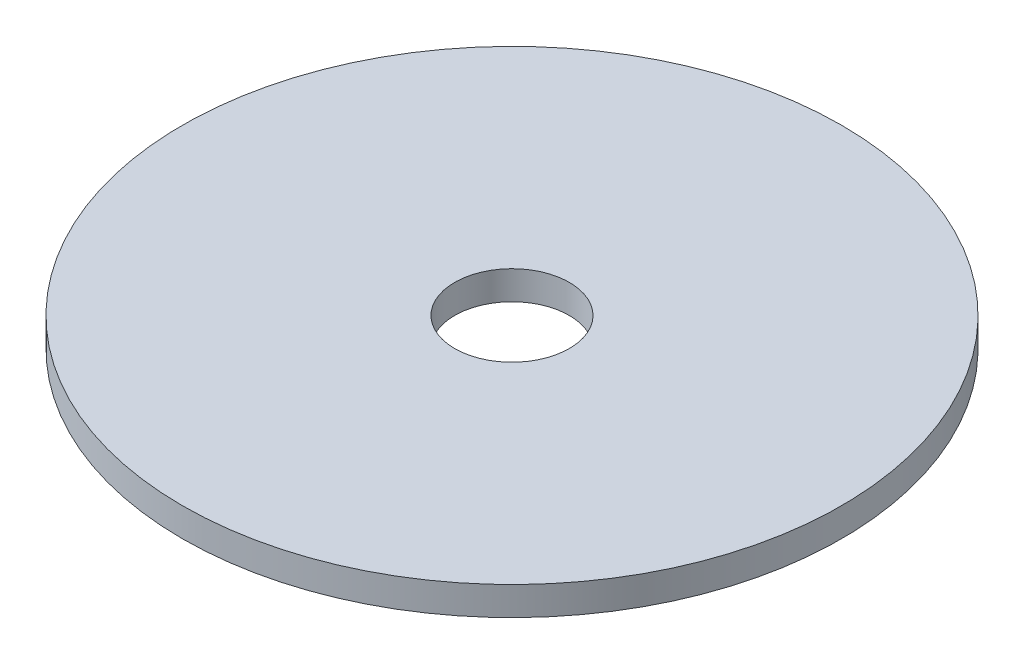
ISO-10303-21;
HEADER;
FILE_DESCRIPTION(('STEP AP214'),'2;1');
FILE_NAME('part.step','',(''),(''),'','','');
FILE_SCHEMA(('AUTOMOTIVE_DESIGN { 1 0 10303 214 1 1 1 1 }'));
ENDSEC;
DATA;
#1=APPLICATION_CONTEXT('core data for automotive mechanical design processes');
#2=APPLICATION_PROTOCOL_DEFINITION('international standard','automotive_design',2000,#1);
#3=PRODUCT_CONTEXT('',#1,'mechanical');
#4=PRODUCT('Part','Part','',(#3));
#5=PRODUCT_RELATED_PRODUCT_CATEGORY('part','',(#4));
#6=PRODUCT_DEFINITION_FORMATION('','',#4);
#7=PRODUCT_DEFINITION_CONTEXT('part definition',#1,'design');
#8=PRODUCT_DEFINITION('design','',#6,#7);
#9=PRODUCT_DEFINITION_SHAPE('','',#8);
#10=(LENGTH_UNIT() NAMED_UNIT(*) SI_UNIT(.MILLI.,.METRE.));
#11=(NAMED_UNIT(*) PLANE_ANGLE_UNIT() SI_UNIT($,.RADIAN.));
#12=(NAMED_UNIT(*) SI_UNIT($,.STERADIAN.) SOLID_ANGLE_UNIT());
#13=UNCERTAINTY_MEASURE_WITH_UNIT(LENGTH_MEASURE(1.E-05),#10,'distance_accuracy_value','');
#14=(GEOMETRIC_REPRESENTATION_CONTEXT(3) GLOBAL_UNCERTAINTY_ASSIGNED_CONTEXT((#13)) GLOBAL_UNIT_ASSIGNED_CONTEXT((#10,
#11,#12)) REPRESENTATION_CONTEXT('',''));
#15=CARTESIAN_POINT('',(0.,0.,0.));
#16=DIRECTION('',(0.,0.,1.));
#17=DIRECTION('',(1.,0.,0.));
#18=AXIS2_PLACEMENT_3D('',#15,#16,#17);
#19=CARTESIAN_POINT('',(0.,0.,0.));
#20=DIRECTION('',(0.,1.,0.));
#21=DIRECTION('',(0.,0.,1.));
#22=AXIS2_PLACEMENT_3D('',#19,#20,#21);
#23=PLANE('',#22);
#24=CARTESIAN_POINT('',(0.,0.,0.));
#25=DIRECTION('',(0.,1.,0.));
#26=DIRECTION('',(0.,0.,1.));
#27=AXIS2_PLACEMENT_3D('',#24,#25,#26);
#28=CIRCLE('',#27,46.);
#29=CARTESIAN_POINT('',(0.,0.,46.));
#30=VERTEX_POINT('',#29);
#31=EDGE_CURVE('E54',#30,#30,#28,.T.);
#32=ORIENTED_EDGE('',*,*,#31,.F.);
#33=EDGE_LOOP('',(#32));
#34=FACE_BOUND('',#33,.T.);
#35=CARTESIAN_POINT('',(0.,0.,0.));
#36=DIRECTION('',(0.,1.,0.));
#37=DIRECTION('',(0.,0.,1.));
#38=AXIS2_PLACEMENT_3D('',#35,#36,#37);
#39=CIRCLE('',#38,8.);
#40=CARTESIAN_POINT('',(0.,0.,8.));
#41=VERTEX_POINT('',#40);
#42=EDGE_CURVE('E49',#41,#41,#39,.T.);
#43=ORIENTED_EDGE('',*,*,#42,.T.);
#44=EDGE_LOOP('',(#43));
#45=FACE_BOUND('',#44,.T.);
#46=CARTESIAN_POINT('',(31.,0.,0.));
#47=DIRECTION('',(0.,1.,0.));
#48=DIRECTION('',(0.,0.,1.));
#49=AXIS2_PLACEMENT_3D('',#46,#47,#48);
#50=CIRCLE('',#49,1.);
#51=CARTESIAN_POINT('',(32.,0.,0.));
#52=VERTEX_POINT('',#51);
#53=CARTESIAN_POINT('',(30.,0.,0.));
#54=VERTEX_POINT('',#53);
#55=EDGE_CURVE('E114',#52,#54,#50,.T.);
#56=ORIENTED_EDGE('',*,*,#55,.T.);
#57=CARTESIAN_POINT('',(0.,0.,0.));
#58=DIRECTION('',(0.,-1.,0.));
#59=DIRECTION('',(0.,0.,-1.));
#60=AXIS2_PLACEMENT_3D('',#57,#58,#59);
#61=CIRCLE('',#60,30.);
#62=CARTESIAN_POINT('',(-30.,0.,0.));
#63=VERTEX_POINT('',#62);
#64=EDGE_CURVE('E104',#54,#63,#61,.T.);
#65=ORIENTED_EDGE('',*,*,#64,.T.);
#66=CARTESIAN_POINT('',(-31.,0.,0.0854321245350118));
#67=DIRECTION('',(0.,-1.,0.));
#68=DIRECTION('',(0.,0.,-1.));
#69=AXIS2_PLACEMENT_3D('',#66,#67,#68);
#70=CIRCLE('',#69,1.0036426893584);
#71=CARTESIAN_POINT('',(-32.,0.,0.));
#72=VERTEX_POINT('',#71);
#73=EDGE_CURVE('E117',#72,#63,#70,.T.);
#74=ORIENTED_EDGE('',*,*,#73,.F.);
#75=CARTESIAN_POINT('',(0.,0.,0.));
#76=DIRECTION('',(0.,-1.,0.));
#77=DIRECTION('',(0.,0.,-1.));
#78=AXIS2_PLACEMENT_3D('',#75,#76,#77);
#79=CIRCLE('',#78,32.);
#80=EDGE_CURVE('E119',#52,#72,#79,.T.);
#81=ORIENTED_EDGE('',*,*,#80,.F.);
#82=EDGE_LOOP('',(#56,#65,#74,#81));
#83=FACE_BOUND('',#82,.T.);
#84=ADVANCED_FACE('F45',(#34,#45,#83),#23,.F.);
#85=CARTESIAN_POINT('',(0.,4.,0.));
#86=DIRECTION('',(0.,-1.,0.));
#87=DIRECTION('',(0.,0.,-1.));
#88=AXIS2_PLACEMENT_3D('',#85,#86,#87);
#89=CYLINDRICAL_SURFACE('',#88,46.);
#90=CARTESIAN_POINT('',(0.,4.,0.));
#91=DIRECTION('',(0.,1.,0.));
#92=DIRECTION('',(0.,0.,1.));
#93=AXIS2_PLACEMENT_3D('',#90,#91,#92);
#94=CIRCLE('',#93,46.);
#95=CARTESIAN_POINT('',(0.,4.,46.));
#96=VERTEX_POINT('',#95);
#97=EDGE_CURVE('E11',#96,#96,#94,.T.);
#98=ORIENTED_EDGE('',*,*,#97,.F.);
#99=EDGE_LOOP('',(#98));
#100=FACE_BOUND('',#99,.T.);
#101=ORIENTED_EDGE('',*,*,#31,.T.);
#102=EDGE_LOOP('',(#101));
#103=FACE_BOUND('',#102,.T.);
#104=ADVANCED_FACE('F47',(#100,#103),#89,.T.);
#105=CARTESIAN_POINT('',(0.,4.,0.));
#106=DIRECTION('',(0.,1.,0.));
#107=DIRECTION('',(0.,0.,1.));
#108=AXIS2_PLACEMENT_3D('',#105,#106,#107);
#109=PLANE('',#108);
#110=CARTESIAN_POINT('',(0.,4.,0.));
#111=DIRECTION('',(0.,1.,0.));
#112=DIRECTION('',(0.,0.,1.));
#113=AXIS2_PLACEMENT_3D('',#110,#111,#112);
#114=CIRCLE('',#113,8.);
#115=CARTESIAN_POINT('',(0.,4.,8.));
#116=VERTEX_POINT('',#115);
#117=EDGE_CURVE('E124',#116,#116,#114,.T.);
#118=ORIENTED_EDGE('',*,*,#117,.F.);
#119=EDGE_LOOP('',(#118));
#120=FACE_BOUND('',#119,.T.);
#121=ORIENTED_EDGE('',*,*,#97,.T.);
#122=EDGE_LOOP('',(#121));
#123=FACE_BOUND('',#122,.T.);
#124=ADVANCED_FACE('F136',(#120,#123),#109,.T.);
#125=CARTESIAN_POINT('',(0.,-0.5,0.));
#126=DIRECTION('',(0.,1.,0.));
#127=DIRECTION('',(0.,0.,1.));
#128=AXIS2_PLACEMENT_3D('',#125,#126,#127);
#129=CYLINDRICAL_SURFACE('',#128,8.);
#130=ORIENTED_EDGE('',*,*,#117,.T.);
#131=EDGE_LOOP('',(#130));
#132=FACE_BOUND('',#131,.T.);
#133=ORIENTED_EDGE('',*,*,#42,.F.);
#134=EDGE_LOOP('',(#133));
#135=FACE_BOUND('',#134,.T.);
#136=ADVANCED_FACE('F134',(#132,#135),#129,.F.);
#137=CARTESIAN_POINT('',(31.,2.,0.));
#138=DIRECTION('',(0.,-1.,0.));
#139=DIRECTION('',(0.,0.,-1.));
#140=AXIS2_PLACEMENT_3D('',#137,#138,#139);
#141=CYLINDRICAL_SURFACE('',#140,1.);
#142=ORIENTED_EDGE('',*,*,#55,.F.);
#143=DIRECTION('',(0.,-1.,0.));
#144=VECTOR('',#143,1.);
#145=CARTESIAN_POINT('',(32.,2.,0.));
#146=LINE('',#145,#144);
#147=CARTESIAN_POINT('',(32.,2.,0.));
#148=VERTEX_POINT('',#147);
#149=EDGE_CURVE('E62',#148,#52,#146,.T.);
#150=ORIENTED_EDGE('',*,*,#149,.F.);
#151=CARTESIAN_POINT('',(31.,2.,0.));
#152=DIRECTION('',(0.,1.,0.));
#153=DIRECTION('',(0.,0.,1.));
#154=AXIS2_PLACEMENT_3D('',#151,#152,#153);
#155=CIRCLE('',#154,1.);
#156=CARTESIAN_POINT('',(30.,2.,0.));
#157=VERTEX_POINT('',#156);
#158=EDGE_CURVE('E92',#148,#157,#155,.T.);
#159=ORIENTED_EDGE('',*,*,#158,.T.);
#160=DIRECTION('',(0.,-1.,0.));
#161=VECTOR('',#160,1.);
#162=CARTESIAN_POINT('',(30.,2.,0.));
#163=LINE('',#162,#161);
#164=EDGE_CURVE('E96',#157,#54,#163,.T.);
#165=ORIENTED_EDGE('',*,*,#164,.T.);
#166=EDGE_LOOP('',(#142,#150,#159,#165));
#167=FACE_BOUND('',#166,.T.);
#168=ADVANCED_FACE('F95',(#167),#141,.F.);
#169=CARTESIAN_POINT('',(0.,2.,0.));
#170=DIRECTION('',(0.,-1.,0.));
#171=DIRECTION('',(0.,0.,-1.));
#172=AXIS2_PLACEMENT_3D('',#169,#170,#171);
#173=CYLINDRICAL_SURFACE('',#172,30.);
#174=ORIENTED_EDGE('',*,*,#64,.F.);
#175=ORIENTED_EDGE('',*,*,#164,.F.);
#176=CARTESIAN_POINT('',(0.,2.,0.));
#177=DIRECTION('',(0.,-1.,0.));
#178=DIRECTION('',(0.,0.,-1.));
#179=AXIS2_PLACEMENT_3D('',#176,#177,#178);
#180=CIRCLE('',#179,30.);
#181=CARTESIAN_POINT('',(-30.,2.,0.));
#182=VERTEX_POINT('',#181);
#183=EDGE_CURVE('E98',#157,#182,#180,.T.);
#184=ORIENTED_EDGE('',*,*,#183,.T.);
#185=DIRECTION('',(0.,-1.,0.));
#186=VECTOR('',#185,1.);
#187=CARTESIAN_POINT('',(-30.,2.,0.));
#188=LINE('',#187,#186);
#189=EDGE_CURVE('E106',#182,#63,#188,.T.);
#190=ORIENTED_EDGE('',*,*,#189,.T.);
#191=EDGE_LOOP('',(#174,#175,#184,#190));
#192=FACE_BOUND('',#191,.T.);
#193=ADVANCED_FACE('F101',(#192),#173,.T.);
#194=CARTESIAN_POINT('',(-31.,2.,0.0854321245350118));
#195=DIRECTION('',(0.,-1.,0.));
#196=DIRECTION('',(0.,0.,-1.));
#197=AXIS2_PLACEMENT_3D('',#194,#195,#196);
#198=CYLINDRICAL_SURFACE('',#197,1.0036426893584);
#199=ORIENTED_EDGE('',*,*,#73,.T.);
#200=ORIENTED_EDGE('',*,*,#189,.F.);
#201=CARTESIAN_POINT('',(-31.,2.,0.0854321245350118));
#202=DIRECTION('',(0.,-1.,0.));
#203=DIRECTION('',(0.,0.,-1.));
#204=AXIS2_PLACEMENT_3D('',#201,#202,#203);
#205=CIRCLE('',#204,1.0036426893584);
#206=CARTESIAN_POINT('',(-32.,2.,0.));
#207=VERTEX_POINT('',#206);
#208=EDGE_CURVE('E109',#207,#182,#205,.T.);
#209=ORIENTED_EDGE('',*,*,#208,.F.);
#210=DIRECTION('',(0.,-1.,0.));
#211=VECTOR('',#210,1.);
#212=CARTESIAN_POINT('',(-32.,2.,0.));
#213=LINE('',#212,#211);
#214=EDGE_CURVE('E88',#207,#72,#213,.T.);
#215=ORIENTED_EDGE('',*,*,#214,.T.);
#216=EDGE_LOOP('',(#199,#200,#209,#215));
#217=FACE_BOUND('',#216,.T.);
#218=ADVANCED_FACE('F185',(#217),#198,.F.);
#219=CARTESIAN_POINT('',(0.,2.,0.));
#220=DIRECTION('',(0.,-1.,0.));
#221=DIRECTION('',(0.,0.,-1.));
#222=AXIS2_PLACEMENT_3D('',#219,#220,#221);
#223=CYLINDRICAL_SURFACE('',#222,32.);
#224=ORIENTED_EDGE('',*,*,#80,.T.);
#225=ORIENTED_EDGE('',*,*,#214,.F.);
#226=CARTESIAN_POINT('',(0.,2.,0.));
#227=DIRECTION('',(0.,1.,0.));
#228=DIRECTION('',(0.,0.,1.));
#229=AXIS2_PLACEMENT_3D('',#226,#227,#228);
#230=CIRCLE('',#229,32.);
#231=EDGE_CURVE('E70',#207,#148,#230,.T.);
#232=ORIENTED_EDGE('',*,*,#231,.T.);
#233=ORIENTED_EDGE('',*,*,#149,.T.);
#234=EDGE_LOOP('',(#224,#225,#232,#233));
#235=FACE_BOUND('',#234,.T.);
#236=ADVANCED_FACE('F194',(#235),#223,.F.);
#237=CARTESIAN_POINT('',(15.5,2.,0.));
#238=DIRECTION('',(0.,1.,0.));
#239=DIRECTION('',(0.,0.,1.));
#240=AXIS2_PLACEMENT_3D('',#237,#238,#239);
#241=PLANE('',#240);
#242=ORIENTED_EDGE('',*,*,#231,.F.);
#243=ORIENTED_EDGE('',*,*,#208,.T.);
#244=ORIENTED_EDGE('',*,*,#183,.F.);
#245=ORIENTED_EDGE('',*,*,#158,.F.);
#246=EDGE_LOOP('',(#242,#243,#244,#245));
#247=FACE_BOUND('',#246,.T.);
#248=ADVANCED_FACE('F108',(#247),#241,.F.);
#249=CLOSED_SHELL('',(#84,#104,#124,#136,#168,#193,#218,#236,#248));
#250=MANIFOLD_SOLID_BREP('B2',#249);
#251=ADVANCED_BREP_SHAPE_REPRESENTATION('',(#18,#250),#14);
#252=SHAPE_DEFINITION_REPRESENTATION(#9,#251);
ENDSEC;
END-ISO-10303-21;
